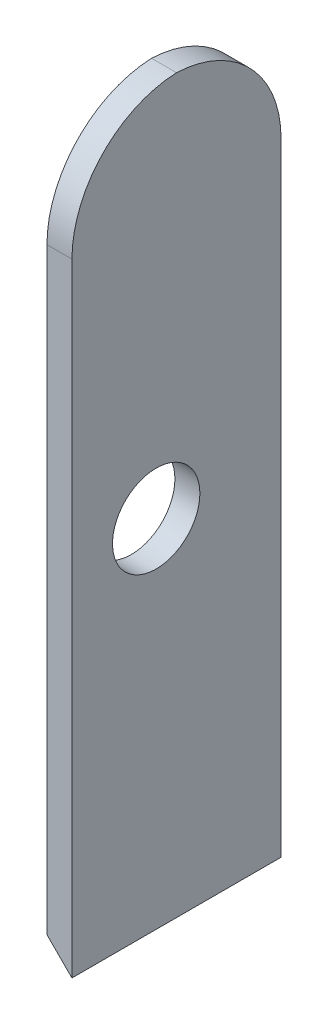
ISO-10303-21;
HEADER;
FILE_DESCRIPTION(('STEP AP214'),'2;1');
FILE_NAME('part.step','',(''),(''),'','','');
FILE_SCHEMA(('AUTOMOTIVE_DESIGN { 1 0 10303 214 1 1 1 1 }'));
ENDSEC;
DATA;
#1=APPLICATION_CONTEXT('core data for automotive mechanical design processes');
#2=APPLICATION_PROTOCOL_DEFINITION('international standard','automotive_design',2000,#1);
#3=PRODUCT_CONTEXT('',#1,'mechanical');
#4=PRODUCT('Part','Part','',(#3));
#5=PRODUCT_RELATED_PRODUCT_CATEGORY('part','',(#4));
#6=PRODUCT_DEFINITION_FORMATION('','',#4);
#7=PRODUCT_DEFINITION_CONTEXT('part definition',#1,'design');
#8=PRODUCT_DEFINITION('design','',#6,#7);
#9=PRODUCT_DEFINITION_SHAPE('','',#8);
#10=(LENGTH_UNIT() NAMED_UNIT(*) SI_UNIT(.MILLI.,.METRE.));
#11=(NAMED_UNIT(*) PLANE_ANGLE_UNIT() SI_UNIT($,.RADIAN.));
#12=(NAMED_UNIT(*) SI_UNIT($,.STERADIAN.) SOLID_ANGLE_UNIT());
#13=UNCERTAINTY_MEASURE_WITH_UNIT(LENGTH_MEASURE(1.E-05),#10,'distance_accuracy_value','');
#14=(GEOMETRIC_REPRESENTATION_CONTEXT(3) GLOBAL_UNCERTAINTY_ASSIGNED_CONTEXT((#13)) GLOBAL_UNIT_ASSIGNED_CONTEXT((#10,
#11,#12)) REPRESENTATION_CONTEXT('',''));
#15=CARTESIAN_POINT('',(0.,0.,0.));
#16=DIRECTION('',(0.,0.,1.));
#17=DIRECTION('',(1.,0.,0.));
#18=AXIS2_PLACEMENT_3D('',#15,#16,#17);
#19=CARTESIAN_POINT('',(0.8,-11.75,3.35));
#20=DIRECTION('',(0.,0.,-1.));
#21=DIRECTION('',(-1.,0.,0.));
#22=AXIS2_PLACEMENT_3D('',#19,#20,#21);
#23=PLANE('',#22);
#24=DIRECTION('',(0.,-1.,0.));
#25=VECTOR('',#24,1.);
#26=CARTESIAN_POINT('',(0.8,-11.75,3.35));
#27=LINE('',#26,#25);
#28=CARTESIAN_POINT('',(0.8,8.25,3.35));
#29=VERTEX_POINT('',#28);
#30=CARTESIAN_POINT('',(0.8,-11.7,3.35));
#31=VERTEX_POINT('',#30);
#32=EDGE_CURVE('E82',#29,#31,#27,.T.);
#33=ORIENTED_EDGE('',*,*,#32,.F.);
#34=DIRECTION('',(-1.,0.,0.));
#35=VECTOR('',#34,1.);
#36=CARTESIAN_POINT('',(0.8,8.25,3.35));
#37=LINE('',#36,#35);
#38=CARTESIAN_POINT('',(0.,8.25,3.35));
#39=VERTEX_POINT('',#38);
#40=EDGE_CURVE('E11',#29,#39,#37,.T.);
#41=ORIENTED_EDGE('',*,*,#40,.T.);
#42=DIRECTION('',(0.,-1.,0.));
#43=VECTOR('',#42,1.);
#44=CARTESIAN_POINT('',(0.,-11.75,3.35));
#45=LINE('',#44,#43);
#46=CARTESIAN_POINT('',(0.,-10.9,3.35));
#47=VERTEX_POINT('',#46);
#48=EDGE_CURVE('E96',#39,#47,#45,.T.);
#49=ORIENTED_EDGE('',*,*,#48,.T.);
#50=DIRECTION('',(-0.707106781186552,0.707106781186544,0.));
#51=VECTOR('',#50,1.);
#52=CARTESIAN_POINT('',(0.850000000000015,-11.75,3.35));
#53=LINE('',#52,#51);
#54=EDGE_CURVE('E94',#47,#31,#53,.F.);
#55=ORIENTED_EDGE('',*,*,#54,.T.);
#56=EDGE_LOOP('',(#33,#41,#49,#55));
#57=FACE_BOUND('',#56,.T.);
#58=ADVANCED_FACE('F41',(#57),#23,.F.);
#59=CARTESIAN_POINT('',(0.8,-11.75,-3.35));
#60=DIRECTION('',(0.,0.,1.));
#61=DIRECTION('',(1.,0.,0.));
#62=AXIS2_PLACEMENT_3D('',#59,#60,#61);
#63=PLANE('',#62);
#64=DIRECTION('',(0.,1.,0.));
#65=VECTOR('',#64,1.);
#66=CARTESIAN_POINT('',(0.,-11.75,-3.35));
#67=LINE('',#66,#65);
#68=CARTESIAN_POINT('',(0.,-10.9,-3.35));
#69=VERTEX_POINT('',#68);
#70=CARTESIAN_POINT('',(0.,8.25,-3.35));
#71=VERTEX_POINT('',#70);
#72=EDGE_CURVE('E91',#69,#71,#67,.T.);
#73=ORIENTED_EDGE('',*,*,#72,.T.);
#74=DIRECTION('',(-1.,0.,0.));
#75=VECTOR('',#74,1.);
#76=CARTESIAN_POINT('',(0.8,8.25,-3.35));
#77=LINE('',#76,#75);
#78=CARTESIAN_POINT('',(0.8,8.25,-3.35));
#79=VERTEX_POINT('',#78);
#80=EDGE_CURVE('E116',#71,#79,#77,.F.);
#81=ORIENTED_EDGE('',*,*,#80,.T.);
#82=DIRECTION('',(0.,1.,0.));
#83=VECTOR('',#82,1.);
#84=CARTESIAN_POINT('',(0.8,-11.75,-3.35));
#85=LINE('',#84,#83);
#86=CARTESIAN_POINT('',(0.8,-11.7,-3.35));
#87=VERTEX_POINT('',#86);
#88=EDGE_CURVE('E90',#87,#79,#85,.T.);
#89=ORIENTED_EDGE('',*,*,#88,.F.);
#90=DIRECTION('',(0.707106781186552,-0.707106781186544,0.));
#91=VECTOR('',#90,1.);
#92=CARTESIAN_POINT('',(0.850000000000015,-11.75,-3.35));
#93=LINE('',#92,#91);
#94=EDGE_CURVE('E105',#87,#69,#93,.F.);
#95=ORIENTED_EDGE('',*,*,#94,.T.);
#96=EDGE_LOOP('',(#73,#81,#89,#95));
#97=FACE_BOUND('',#96,.T.);
#98=ADVANCED_FACE('F123',(#97),#63,.F.);
#99=CARTESIAN_POINT('',(0.8,0.,0.));
#100=DIRECTION('',(1.,0.,0.));
#101=DIRECTION('',(0.,0.,-1.));
#102=AXIS2_PLACEMENT_3D('',#99,#100,#101);
#103=PLANE('',#102);
#104=CARTESIAN_POINT('',(0.8,-0.299999999999986,0.649999999999999));
#105=DIRECTION('',(1.,0.,0.));
#106=DIRECTION('',(0.,0.,-1.));
#107=AXIS2_PLACEMENT_3D('',#104,#105,#106);
#108=CIRCLE('',#107,1.4);
#109=CARTESIAN_POINT('',(0.8,-0.299999999999986,-0.750000000000001));
#110=VERTEX_POINT('',#109);
#111=EDGE_CURVE('E134',#110,#110,#108,.T.);
#112=ORIENTED_EDGE('',*,*,#111,.F.);
#113=EDGE_LOOP('',(#112));
#114=FACE_BOUND('',#113,.T.);
#115=ORIENTED_EDGE('',*,*,#88,.T.);
#116=CARTESIAN_POINT('',(0.8,8.25,0.149999999999999));
#117=DIRECTION('',(1.,0.,0.));
#118=DIRECTION('',(0.,0.,-1.));
#119=AXIS2_PLACEMENT_3D('',#116,#117,#118);
#120=CIRCLE('',#119,3.5);
#121=CARTESIAN_POINT('',(0.8,11.7467842369812,0.));
#122=VERTEX_POINT('',#121);
#123=EDGE_CURVE('E50',#79,#122,#120,.T.);
#124=ORIENTED_EDGE('',*,*,#123,.T.);
#125=CARTESIAN_POINT('',(0.8,8.25,-0.150000000000001));
#126=DIRECTION('',(1.,0.,0.));
#127=DIRECTION('',(0.,0.,-1.));
#128=AXIS2_PLACEMENT_3D('',#125,#126,#127);
#129=CIRCLE('',#128,3.5);
#130=EDGE_CURVE('E60',#122,#29,#129,.T.);
#131=ORIENTED_EDGE('',*,*,#130,.T.);
#132=ORIENTED_EDGE('',*,*,#32,.T.);
#133=DIRECTION('',(0.,0.,1.));
#134=VECTOR('',#133,1.);
#135=CARTESIAN_POINT('',(0.8,-11.7,0.));
#136=LINE('',#135,#134);
#137=EDGE_CURVE('E86',#31,#87,#136,.F.);
#138=ORIENTED_EDGE('',*,*,#137,.T.);
#139=EDGE_LOOP('',(#115,#124,#131,#132,#138));
#140=FACE_BOUND('',#139,.T.);
#141=ADVANCED_FACE('F84',(#114,#140),#103,.T.);
#142=CARTESIAN_POINT('',(0.,0.,0.));
#143=DIRECTION('',(1.,0.,0.));
#144=DIRECTION('',(0.,0.,-1.));
#145=AXIS2_PLACEMENT_3D('',#142,#143,#144);
#146=PLANE('',#145);
#147=CARTESIAN_POINT('',(0.,-0.299999999999986,0.649999999999999));
#148=DIRECTION('',(1.,0.,0.));
#149=DIRECTION('',(0.,0.,-1.));
#150=AXIS2_PLACEMENT_3D('',#147,#148,#149);
#151=CIRCLE('',#150,1.4);
#152=CARTESIAN_POINT('',(0.,-0.299999999999986,-0.750000000000001));
#153=VERTEX_POINT('',#152);
#154=EDGE_CURVE('E132',#153,#153,#151,.T.);
#155=ORIENTED_EDGE('',*,*,#154,.T.);
#156=EDGE_LOOP('',(#155));
#157=FACE_BOUND('',#156,.T.);
#158=CARTESIAN_POINT('',(0.,8.25,-0.150000000000001));
#159=DIRECTION('',(1.,0.,0.));
#160=DIRECTION('',(0.,0.,-1.));
#161=AXIS2_PLACEMENT_3D('',#158,#159,#160);
#162=CIRCLE('',#161,3.5);
#163=CARTESIAN_POINT('',(0.,11.7467842369812,0.));
#164=VERTEX_POINT('',#163);
#165=EDGE_CURVE('E100',#39,#164,#162,.F.);
#166=ORIENTED_EDGE('',*,*,#165,.T.);
#167=CARTESIAN_POINT('',(0.,8.25,0.149999999999999));
#168=DIRECTION('',(1.,0.,0.));
#169=DIRECTION('',(0.,0.,-1.));
#170=AXIS2_PLACEMENT_3D('',#167,#168,#169);
#171=CIRCLE('',#170,3.5);
#172=EDGE_CURVE('E114',#164,#71,#171,.F.);
#173=ORIENTED_EDGE('',*,*,#172,.T.);
#174=ORIENTED_EDGE('',*,*,#72,.F.);
#175=DIRECTION('',(0.,0.,1.));
#176=VECTOR('',#175,1.);
#177=CARTESIAN_POINT('',(0.,-10.9,0.));
#178=LINE('',#177,#176);
#179=EDGE_CURVE('E101',#69,#47,#178,.T.);
#180=ORIENTED_EDGE('',*,*,#179,.T.);
#181=ORIENTED_EDGE('',*,*,#48,.F.);
#182=EDGE_LOOP('',(#166,#173,#174,#180,#181));
#183=FACE_BOUND('',#182,.T.);
#184=ADVANCED_FACE('F145',(#157,#183),#146,.F.);
#185=CARTESIAN_POINT('',(0.850000000000015,-11.75,-3.35));
#186=DIRECTION('',(0.707106781186543,0.707106781186551,0.));
#187=DIRECTION('',(0.,0.,-1.));
#188=AXIS2_PLACEMENT_3D('',#185,#186,#187);
#189=PLANE('',#188);
#190=ORIENTED_EDGE('',*,*,#54,.F.);
#191=ORIENTED_EDGE('',*,*,#179,.F.);
#192=ORIENTED_EDGE('',*,*,#94,.F.);
#193=ORIENTED_EDGE('',*,*,#137,.F.);
#194=EDGE_LOOP('',(#190,#191,#192,#193));
#195=FACE_BOUND('',#194,.T.);
#196=ADVANCED_FACE('F104',(#195),#189,.F.);
#197=CARTESIAN_POINT('',(0.8,8.25,-0.150000000000001));
#198=DIRECTION('',(-1.,0.,0.));
#199=DIRECTION('',(0.,0.,1.));
#200=AXIS2_PLACEMENT_3D('',#197,#198,#199);
#201=CYLINDRICAL_SURFACE('',#200,3.5);
#202=ORIENTED_EDGE('',*,*,#40,.F.);
#203=ORIENTED_EDGE('',*,*,#130,.F.);
#204=DIRECTION('',(-1.,0.,0.));
#205=VECTOR('',#204,1.);
#206=CARTESIAN_POINT('',(0.4,11.7467842369812,0.));
#207=LINE('',#206,#205);
#208=EDGE_CURVE('E45',#164,#122,#207,.F.);
#209=ORIENTED_EDGE('',*,*,#208,.F.);
#210=ORIENTED_EDGE('',*,*,#165,.F.);
#211=EDGE_LOOP('',(#202,#203,#209,#210));
#212=FACE_BOUND('',#211,.T.);
#213=ADVANCED_FACE('F43',(#212),#201,.T.);
#214=CARTESIAN_POINT('',(0.8,8.25,0.149999999999999));
#215=DIRECTION('',(-1.,0.,0.));
#216=DIRECTION('',(0.,0.,1.));
#217=AXIS2_PLACEMENT_3D('',#214,#215,#216);
#218=CYLINDRICAL_SURFACE('',#217,3.5);
#219=ORIENTED_EDGE('',*,*,#123,.F.);
#220=ORIENTED_EDGE('',*,*,#80,.F.);
#221=ORIENTED_EDGE('',*,*,#172,.F.);
#222=ORIENTED_EDGE('',*,*,#208,.T.);
#223=EDGE_LOOP('',(#219,#220,#221,#222));
#224=FACE_BOUND('',#223,.T.);
#225=ADVANCED_FACE('F127',(#224),#218,.T.);
#226=CARTESIAN_POINT('',(0.,-0.299999999999986,0.649999999999999));
#227=DIRECTION('',(1.,0.,0.));
#228=DIRECTION('',(0.,0.,-1.));
#229=AXIS2_PLACEMENT_3D('',#226,#227,#228);
#230=CYLINDRICAL_SURFACE('',#229,1.4);
#231=ORIENTED_EDGE('',*,*,#154,.F.);
#232=EDGE_LOOP('',(#231));
#233=FACE_BOUND('',#232,.T.);
#234=ORIENTED_EDGE('',*,*,#111,.T.);
#235=EDGE_LOOP('',(#234));
#236=FACE_BOUND('',#235,.T.);
#237=ADVANCED_FACE('F142',(#233,#236),#230,.F.);
#238=CLOSED_SHELL('',(#58,#98,#141,#184,#196,#213,#225,#237));
#239=MANIFOLD_SOLID_BREP('B2',#238);
#240=ADVANCED_BREP_SHAPE_REPRESENTATION('',(#18,#239),#14);
#241=SHAPE_DEFINITION_REPRESENTATION(#9,#240);
ENDSEC;
END-ISO-10303-21;
